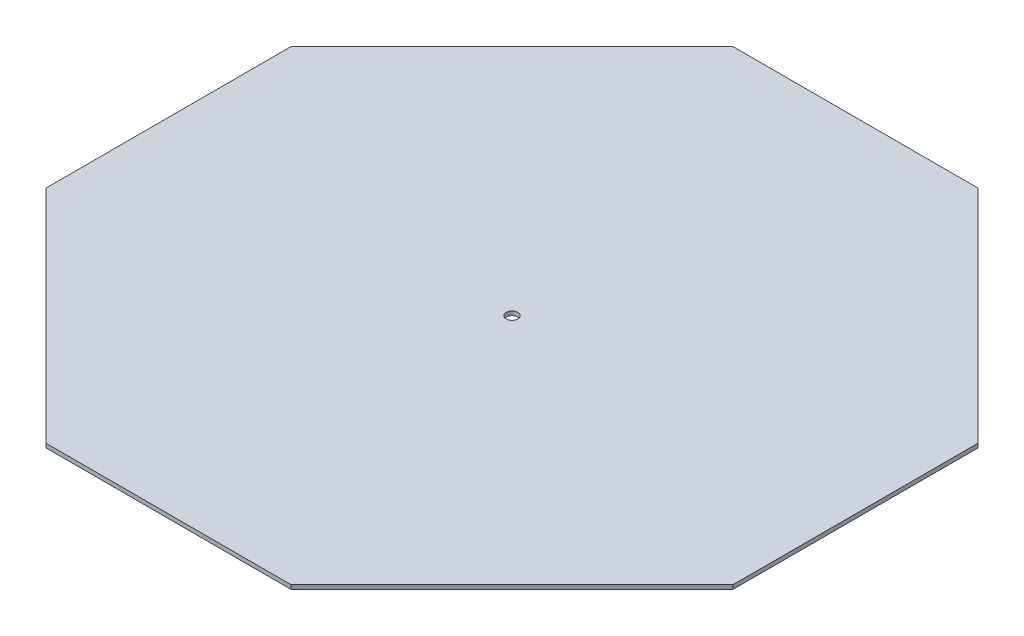
ISO-10303-21;
HEADER;
FILE_DESCRIPTION(('STEP AP214'),'2;1');
FILE_NAME('part.step','',(''),(''),'','','');
FILE_SCHEMA(('AUTOMOTIVE_DESIGN { 1 0 10303 214 1 1 1 1 }'));
ENDSEC;
DATA;
#1=APPLICATION_CONTEXT('core data for automotive mechanical design processes');
#2=APPLICATION_PROTOCOL_DEFINITION('international standard','automotive_design',2000,#1);
#3=PRODUCT_CONTEXT('',#1,'mechanical');
#4=PRODUCT('Part','Part','',(#3));
#5=PRODUCT_RELATED_PRODUCT_CATEGORY('part','',(#4));
#6=PRODUCT_DEFINITION_FORMATION('','',#4);
#7=PRODUCT_DEFINITION_CONTEXT('part definition',#1,'design');
#8=PRODUCT_DEFINITION('design','',#6,#7);
#9=PRODUCT_DEFINITION_SHAPE('','',#8);
#10=(LENGTH_UNIT() NAMED_UNIT(*) SI_UNIT(.MILLI.,.METRE.));
#11=(NAMED_UNIT(*) PLANE_ANGLE_UNIT() SI_UNIT($,.RADIAN.));
#12=(NAMED_UNIT(*) SI_UNIT($,.STERADIAN.) SOLID_ANGLE_UNIT());
#13=UNCERTAINTY_MEASURE_WITH_UNIT(LENGTH_MEASURE(1.E-05),#10,'distance_accuracy_value','');
#14=(GEOMETRIC_REPRESENTATION_CONTEXT(3) GLOBAL_UNCERTAINTY_ASSIGNED_CONTEXT((#13)) GLOBAL_UNIT_ASSIGNED_CONTEXT((#10,
#11,#12)) REPRESENTATION_CONTEXT('',''));
#15=CARTESIAN_POINT('',(0.,0.,0.));
#16=DIRECTION('',(0.,0.,1.));
#17=DIRECTION('',(1.,0.,0.));
#18=AXIS2_PLACEMENT_3D('',#15,#16,#17);
#19=CARTESIAN_POINT('',(-253.,3.,90.2426406871193));
#20=DIRECTION('',(1.,0.,0.));
#21=DIRECTION('',(0.,0.,-1.));
#22=AXIS2_PLACEMENT_3D('',#19,#20,#21);
#23=PLANE('',#22);
#24=DIRECTION('',(0.,0.,1.));
#25=VECTOR('',#24,1.);
#26=CARTESIAN_POINT('',(-253.,0.,90.2426406871193));
#27=LINE('',#26,#25);
#28=CARTESIAN_POINT('',(-253.,0.,-90.2426406871193));
#29=VERTEX_POINT('',#28);
#30=CARTESIAN_POINT('',(-253.,0.,90.2426406871193));
#31=VERTEX_POINT('',#30);
#32=EDGE_CURVE('E133',#29,#31,#27,.T.);
#33=ORIENTED_EDGE('',*,*,#32,.T.);
#34=DIRECTION('',(0.,-1.,0.));
#35=VECTOR('',#34,1.);
#36=CARTESIAN_POINT('',(-253.,3.,90.2426406871193));
#37=LINE('',#36,#35);
#38=CARTESIAN_POINT('',(-253.,3.,90.2426406871193));
#39=VERTEX_POINT('',#38);
#40=EDGE_CURVE('E11',#39,#31,#37,.T.);
#41=ORIENTED_EDGE('',*,*,#40,.F.);
#42=DIRECTION('',(0.,0.,1.));
#43=VECTOR('',#42,1.);
#44=CARTESIAN_POINT('',(-253.,3.,90.2426406871193));
#45=LINE('',#44,#43);
#46=CARTESIAN_POINT('',(-253.,3.,-90.2426406871193));
#47=VERTEX_POINT('',#46);
#48=EDGE_CURVE('E148',#47,#39,#45,.T.);
#49=ORIENTED_EDGE('',*,*,#48,.F.);
#50=DIRECTION('',(0.,-1.,0.));
#51=VECTOR('',#50,1.);
#52=CARTESIAN_POINT('',(-253.,3.,-90.2426406871193));
#53=LINE('',#52,#51);
#54=EDGE_CURVE('E129',#47,#29,#53,.T.);
#55=ORIENTED_EDGE('',*,*,#54,.T.);
#56=EDGE_LOOP('',(#33,#41,#49,#55));
#57=FACE_BOUND('',#56,.T.);
#58=ADVANCED_FACE('F37',(#57),#23,.F.);
#59=CARTESIAN_POINT('',(-90.2426406871192,3.,253.));
#60=DIRECTION('',(0.707106781186547,0.,-0.707106781186547));
#61=DIRECTION('',(-0.707106781186548,0.,-0.707106781186548));
#62=AXIS2_PLACEMENT_3D('',#59,#60,#61);
#63=PLANE('',#62);
#64=DIRECTION('',(0.707106781186548,0.,0.707106781186548));
#65=VECTOR('',#64,1.);
#66=CARTESIAN_POINT('',(-90.2426406871192,0.,253.));
#67=LINE('',#66,#65);
#68=CARTESIAN_POINT('',(-90.2426406871192,0.,253.));
#69=VERTEX_POINT('',#68);
#70=EDGE_CURVE('E136',#31,#69,#67,.T.);
#71=ORIENTED_EDGE('',*,*,#70,.T.);
#72=DIRECTION('',(0.,-1.,0.));
#73=VECTOR('',#72,1.);
#74=CARTESIAN_POINT('',(-90.2426406871192,3.,253.));
#75=LINE('',#74,#73);
#76=CARTESIAN_POINT('',(-90.2426406871192,3.,253.));
#77=VERTEX_POINT('',#76);
#78=EDGE_CURVE('E45',#77,#69,#75,.T.);
#79=ORIENTED_EDGE('',*,*,#78,.F.);
#80=DIRECTION('',(0.707106781186548,0.,0.707106781186548));
#81=VECTOR('',#80,1.);
#82=CARTESIAN_POINT('',(-90.2426406871192,3.,253.));
#83=LINE('',#82,#81);
#84=EDGE_CURVE('E96',#39,#77,#83,.T.);
#85=ORIENTED_EDGE('',*,*,#84,.F.);
#86=ORIENTED_EDGE('',*,*,#40,.T.);
#87=EDGE_LOOP('',(#71,#79,#85,#86));
#88=FACE_BOUND('',#87,.T.);
#89=ADVANCED_FACE('F205',(#88),#63,.F.);
#90=CARTESIAN_POINT('',(90.2426406871192,3.,253.));
#91=DIRECTION('',(0.,0.,-1.));
#92=DIRECTION('',(-1.,0.,0.));
#93=AXIS2_PLACEMENT_3D('',#90,#91,#92);
#94=PLANE('',#93);
#95=DIRECTION('',(1.,0.,0.));
#96=VECTOR('',#95,1.);
#97=CARTESIAN_POINT('',(90.2426406871192,0.,253.));
#98=LINE('',#97,#96);
#99=CARTESIAN_POINT('',(90.2426406871192,0.,253.));
#100=VERTEX_POINT('',#99);
#101=EDGE_CURVE('E139',#69,#100,#98,.T.);
#102=ORIENTED_EDGE('',*,*,#101,.T.);
#103=DIRECTION('',(0.,-1.,0.));
#104=VECTOR('',#103,1.);
#105=CARTESIAN_POINT('',(90.2426406871192,3.,253.));
#106=LINE('',#105,#104);
#107=CARTESIAN_POINT('',(90.2426406871192,3.,253.));
#108=VERTEX_POINT('',#107);
#109=EDGE_CURVE('E155',#108,#100,#106,.T.);
#110=ORIENTED_EDGE('',*,*,#109,.F.);
#111=DIRECTION('',(1.,0.,0.));
#112=VECTOR('',#111,1.);
#113=CARTESIAN_POINT('',(90.2426406871192,3.,253.));
#114=LINE('',#113,#112);
#115=EDGE_CURVE('E163',#77,#108,#114,.T.);
#116=ORIENTED_EDGE('',*,*,#115,.F.);
#117=ORIENTED_EDGE('',*,*,#78,.T.);
#118=EDGE_LOOP('',(#102,#110,#116,#117));
#119=FACE_BOUND('',#118,.T.);
#120=ADVANCED_FACE('F161',(#119),#94,.F.);
#121=CARTESIAN_POINT('',(253.,3.,90.2426406871193));
#122=DIRECTION('',(-0.707106781186547,0.,-0.707106781186547));
#123=DIRECTION('',(-0.707106781186548,0.,0.707106781186548));
#124=AXIS2_PLACEMENT_3D('',#121,#122,#123);
#125=PLANE('',#124);
#126=DIRECTION('',(0.707106781186548,0.,-0.707106781186548));
#127=VECTOR('',#126,1.);
#128=CARTESIAN_POINT('',(253.,0.,90.2426406871193));
#129=LINE('',#128,#127);
#130=CARTESIAN_POINT('',(253.,0.,90.2426406871193));
#131=VERTEX_POINT('',#130);
#132=EDGE_CURVE('E141',#100,#131,#129,.T.);
#133=ORIENTED_EDGE('',*,*,#132,.T.);
#134=DIRECTION('',(0.,-1.,0.));
#135=VECTOR('',#134,1.);
#136=CARTESIAN_POINT('',(253.,3.,90.2426406871193));
#137=LINE('',#136,#135);
#138=CARTESIAN_POINT('',(253.,3.,90.2426406871193));
#139=VERTEX_POINT('',#138);
#140=EDGE_CURVE('E152',#139,#131,#137,.T.);
#141=ORIENTED_EDGE('',*,*,#140,.F.);
#142=DIRECTION('',(0.707106781186548,0.,-0.707106781186548));
#143=VECTOR('',#142,1.);
#144=CARTESIAN_POINT('',(253.,3.,90.2426406871193));
#145=LINE('',#144,#143);
#146=EDGE_CURVE('E175',#108,#139,#145,.T.);
#147=ORIENTED_EDGE('',*,*,#146,.F.);
#148=ORIENTED_EDGE('',*,*,#109,.T.);
#149=EDGE_LOOP('',(#133,#141,#147,#148));
#150=FACE_BOUND('',#149,.T.);
#151=ADVANCED_FACE('F171',(#150),#125,.F.);
#152=CARTESIAN_POINT('',(253.,3.,-90.2426406871194));
#153=DIRECTION('',(-1.,0.,0.));
#154=DIRECTION('',(0.,0.,1.));
#155=AXIS2_PLACEMENT_3D('',#152,#153,#154);
#156=PLANE('',#155);
#157=DIRECTION('',(0.,0.,-1.));
#158=VECTOR('',#157,1.);
#159=CARTESIAN_POINT('',(253.,0.,-90.2426406871194));
#160=LINE('',#159,#158);
#161=CARTESIAN_POINT('',(253.,0.,-90.2426406871194));
#162=VERTEX_POINT('',#161);
#163=EDGE_CURVE('E143',#131,#162,#160,.T.);
#164=ORIENTED_EDGE('',*,*,#163,.T.);
#165=DIRECTION('',(0.,-1.,0.));
#166=VECTOR('',#165,1.);
#167=CARTESIAN_POINT('',(253.,3.,-90.2426406871194));
#168=LINE('',#167,#166);
#169=CARTESIAN_POINT('',(253.,3.,-90.2426406871194));
#170=VERTEX_POINT('',#169);
#171=EDGE_CURVE('E124',#170,#162,#168,.T.);
#172=ORIENTED_EDGE('',*,*,#171,.F.);
#173=DIRECTION('',(0.,0.,-1.));
#174=VECTOR('',#173,1.);
#175=CARTESIAN_POINT('',(253.,3.,-90.2426406871194));
#176=LINE('',#175,#174);
#177=EDGE_CURVE('E115',#139,#170,#176,.T.);
#178=ORIENTED_EDGE('',*,*,#177,.F.);
#179=ORIENTED_EDGE('',*,*,#140,.T.);
#180=EDGE_LOOP('',(#164,#172,#178,#179));
#181=FACE_BOUND('',#180,.T.);
#182=ADVANCED_FACE('F174',(#181),#156,.F.);
#183=CARTESIAN_POINT('',(90.2426406871193,3.,-253.));
#184=DIRECTION('',(-0.707106781186547,0.,0.707106781186547));
#185=DIRECTION('',(0.707106781186548,0.,0.707106781186548));
#186=AXIS2_PLACEMENT_3D('',#183,#184,#185);
#187=PLANE('',#186);
#188=DIRECTION('',(-0.707106781186548,0.,-0.707106781186548));
#189=VECTOR('',#188,1.);
#190=CARTESIAN_POINT('',(90.2426406871193,0.,-253.));
#191=LINE('',#190,#189);
#192=CARTESIAN_POINT('',(90.2426406871193,0.,-253.));
#193=VERTEX_POINT('',#192);
#194=EDGE_CURVE('E123',#162,#193,#191,.T.);
#195=ORIENTED_EDGE('',*,*,#194,.T.);
#196=DIRECTION('',(0.,-1.,0.));
#197=VECTOR('',#196,1.);
#198=CARTESIAN_POINT('',(90.2426406871193,3.,-253.));
#199=LINE('',#198,#197);
#200=CARTESIAN_POINT('',(90.2426406871193,3.,-253.));
#201=VERTEX_POINT('',#200);
#202=EDGE_CURVE('E120',#201,#193,#199,.T.);
#203=ORIENTED_EDGE('',*,*,#202,.F.);
#204=DIRECTION('',(-0.707106781186548,0.,-0.707106781186548));
#205=VECTOR('',#204,1.);
#206=CARTESIAN_POINT('',(90.2426406871193,3.,-253.));
#207=LINE('',#206,#205);
#208=EDGE_CURVE('E109',#170,#201,#207,.T.);
#209=ORIENTED_EDGE('',*,*,#208,.F.);
#210=ORIENTED_EDGE('',*,*,#171,.T.);
#211=EDGE_LOOP('',(#195,#203,#209,#210));
#212=FACE_BOUND('',#211,.T.);
#213=ADVANCED_FACE('F121',(#212),#187,.F.);
#214=CARTESIAN_POINT('',(-90.2426406871192,3.,-253.));
#215=DIRECTION('',(0.,0.,1.));
#216=DIRECTION('',(1.,0.,0.));
#217=AXIS2_PLACEMENT_3D('',#214,#215,#216);
#218=PLANE('',#217);
#219=DIRECTION('',(-1.,0.,0.));
#220=VECTOR('',#219,1.);
#221=CARTESIAN_POINT('',(-90.2426406871192,0.,-253.));
#222=LINE('',#221,#220);
#223=CARTESIAN_POINT('',(-90.2426406871192,0.,-253.));
#224=VERTEX_POINT('',#223);
#225=EDGE_CURVE('E82',#193,#224,#222,.T.);
#226=ORIENTED_EDGE('',*,*,#225,.T.);
#227=DIRECTION('',(0.,-1.,0.));
#228=VECTOR('',#227,1.);
#229=CARTESIAN_POINT('',(-90.2426406871192,3.,-253.));
#230=LINE('',#229,#228);
#231=CARTESIAN_POINT('',(-90.2426406871192,3.,-253.));
#232=VERTEX_POINT('',#231);
#233=EDGE_CURVE('E125',#232,#224,#230,.T.);
#234=ORIENTED_EDGE('',*,*,#233,.F.);
#235=DIRECTION('',(-1.,0.,0.));
#236=VECTOR('',#235,1.);
#237=CARTESIAN_POINT('',(-90.2426406871192,3.,-253.));
#238=LINE('',#237,#236);
#239=EDGE_CURVE('E113',#201,#232,#238,.T.);
#240=ORIENTED_EDGE('',*,*,#239,.F.);
#241=ORIENTED_EDGE('',*,*,#202,.T.);
#242=EDGE_LOOP('',(#226,#234,#240,#241));
#243=FACE_BOUND('',#242,.T.);
#244=ADVANCED_FACE('F127',(#243),#218,.F.);
#245=CARTESIAN_POINT('',(-253.,3.,-90.2426406871193));
#246=DIRECTION('',(0.707106781186547,0.,0.707106781186547));
#247=DIRECTION('',(0.707106781186548,0.,-0.707106781186548));
#248=AXIS2_PLACEMENT_3D('',#245,#246,#247);
#249=PLANE('',#248);
#250=DIRECTION('',(-0.707106781186548,0.,0.707106781186548));
#251=VECTOR('',#250,1.);
#252=CARTESIAN_POINT('',(-253.,0.,-90.2426406871193));
#253=LINE('',#252,#251);
#254=EDGE_CURVE('E88',#224,#29,#253,.T.);
#255=ORIENTED_EDGE('',*,*,#254,.T.);
#256=ORIENTED_EDGE('',*,*,#54,.F.);
#257=DIRECTION('',(-0.707106781186548,0.,0.707106781186548));
#258=VECTOR('',#257,1.);
#259=CARTESIAN_POINT('',(-253.,3.,-90.2426406871193));
#260=LINE('',#259,#258);
#261=EDGE_CURVE('E53',#232,#47,#260,.T.);
#262=ORIENTED_EDGE('',*,*,#261,.F.);
#263=ORIENTED_EDGE('',*,*,#233,.T.);
#264=EDGE_LOOP('',(#255,#256,#262,#263));
#265=FACE_BOUND('',#264,.T.);
#266=ADVANCED_FACE('F195',(#265),#249,.F.);
#267=CARTESIAN_POINT('',(0.,3.,0.));
#268=DIRECTION('',(0.,-1.,0.));
#269=DIRECTION('',(0.,0.,-1.));
#270=AXIS2_PLACEMENT_3D('',#267,#268,#269);
#271=PLANE('',#270);
#272=CARTESIAN_POINT('',(0.,3.,0.));
#273=DIRECTION('',(0.,1.,0.));
#274=DIRECTION('',(0.,0.,1.));
#275=AXIS2_PLACEMENT_3D('',#272,#273,#274);
#276=CIRCLE('',#275,4.25);
#277=CARTESIAN_POINT('',(0.,3.,4.25));
#278=VERTEX_POINT('',#277);
#279=EDGE_CURVE('E181',#278,#278,#276,.T.);
#280=ORIENTED_EDGE('',*,*,#279,.F.);
#281=EDGE_LOOP('',(#280));
#282=FACE_BOUND('',#281,.T.);
#283=ORIENTED_EDGE('',*,*,#48,.T.);
#284=ORIENTED_EDGE('',*,*,#84,.T.);
#285=ORIENTED_EDGE('',*,*,#115,.T.);
#286=ORIENTED_EDGE('',*,*,#146,.T.);
#287=ORIENTED_EDGE('',*,*,#177,.T.);
#288=ORIENTED_EDGE('',*,*,#208,.T.);
#289=ORIENTED_EDGE('',*,*,#239,.T.);
#290=ORIENTED_EDGE('',*,*,#261,.T.);
#291=EDGE_LOOP('',(#283,#284,#285,#286,#287,#288,#289,#290));
#292=FACE_BOUND('',#291,.T.);
#293=ADVANCED_FACE('F111',(#282,#292),#271,.F.);
#294=CARTESIAN_POINT('',(0.,0.,0.));
#295=DIRECTION('',(0.,-1.,0.));
#296=DIRECTION('',(0.,0.,-1.));
#297=AXIS2_PLACEMENT_3D('',#294,#295,#296);
#298=PLANE('',#297);
#299=CARTESIAN_POINT('',(0.,0.,0.));
#300=DIRECTION('',(0.,1.,0.));
#301=DIRECTION('',(0.,0.,1.));
#302=AXIS2_PLACEMENT_3D('',#299,#300,#301);
#303=CIRCLE('',#302,4.25);
#304=CARTESIAN_POINT('',(0.,0.,4.25));
#305=VERTEX_POINT('',#304);
#306=EDGE_CURVE('E137',#305,#305,#303,.T.);
#307=ORIENTED_EDGE('',*,*,#306,.T.);
#308=EDGE_LOOP('',(#307));
#309=FACE_BOUND('',#308,.T.);
#310=ORIENTED_EDGE('',*,*,#32,.F.);
#311=ORIENTED_EDGE('',*,*,#254,.F.);
#312=ORIENTED_EDGE('',*,*,#225,.F.);
#313=ORIENTED_EDGE('',*,*,#194,.F.);
#314=ORIENTED_EDGE('',*,*,#163,.F.);
#315=ORIENTED_EDGE('',*,*,#132,.F.);
#316=ORIENTED_EDGE('',*,*,#101,.F.);
#317=ORIENTED_EDGE('',*,*,#70,.F.);
#318=EDGE_LOOP('',(#310,#311,#312,#313,#314,#315,#316,#317));
#319=FACE_BOUND('',#318,.T.);
#320=ADVANCED_FACE('F167',(#309,#319),#298,.T.);
#321=CARTESIAN_POINT('',(0.,0.,0.));
#322=DIRECTION('',(0.,1.,0.));
#323=DIRECTION('',(0.,0.,1.));
#324=AXIS2_PLACEMENT_3D('',#321,#322,#323);
#325=CYLINDRICAL_SURFACE('',#324,4.25);
#326=ORIENTED_EDGE('',*,*,#306,.F.);
#327=EDGE_LOOP('',(#326));
#328=FACE_BOUND('',#327,.T.);
#329=ORIENTED_EDGE('',*,*,#279,.T.);
#330=EDGE_LOOP('',(#329));
#331=FACE_BOUND('',#330,.T.);
#332=ADVANCED_FACE('F188',(#328,#331),#325,.F.);
#333=CLOSED_SHELL('',(#58,#89,#120,#151,#182,#213,#244,#266,#293,#320,#332));
#334=MANIFOLD_SOLID_BREP('B2',#333);
#335=ADVANCED_BREP_SHAPE_REPRESENTATION('',(#18,#334),#14);
#336=SHAPE_DEFINITION_REPRESENTATION(#9,#335);
ENDSEC;
END-ISO-10303-21;
